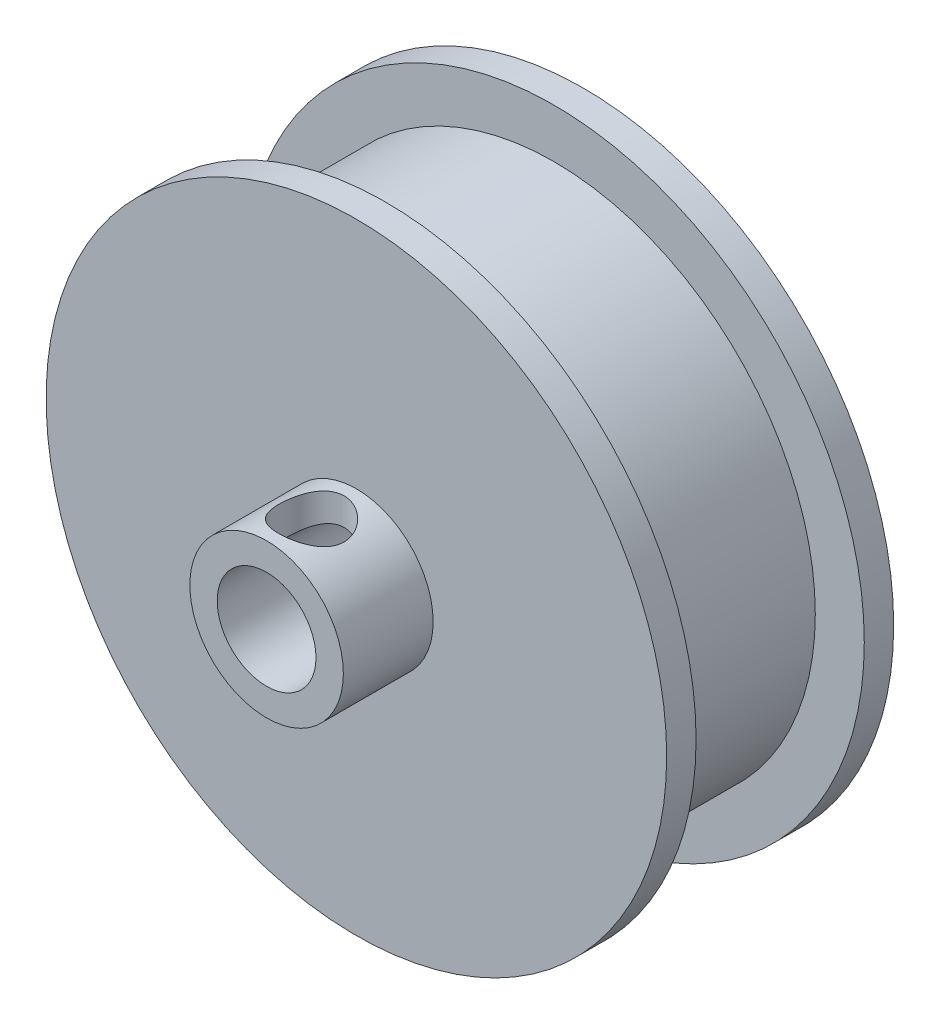
ISO-10303-21;
HEADER;
FILE_DESCRIPTION(('STEP AP214'),'2;1');
FILE_NAME('part.step','',(''),(''),'','','');
FILE_SCHEMA(('AUTOMOTIVE_DESIGN { 1 0 10303 214 1 1 1 1 }'));
ENDSEC;
DATA;
#1=APPLICATION_CONTEXT('core data for automotive mechanical design processes');
#2=APPLICATION_PROTOCOL_DEFINITION('international standard','automotive_design',2000,#1);
#3=PRODUCT_CONTEXT('',#1,'mechanical');
#4=PRODUCT('Part','Part','',(#3));
#5=PRODUCT_RELATED_PRODUCT_CATEGORY('part','',(#4));
#6=PRODUCT_DEFINITION_FORMATION('','',#4);
#7=PRODUCT_DEFINITION_CONTEXT('part definition',#1,'design');
#8=PRODUCT_DEFINITION('design','',#6,#7);
#9=PRODUCT_DEFINITION_SHAPE('','',#8);
#10=(LENGTH_UNIT() NAMED_UNIT(*) SI_UNIT(.MILLI.,.METRE.));
#11=(NAMED_UNIT(*) PLANE_ANGLE_UNIT() SI_UNIT($,.RADIAN.));
#12=(NAMED_UNIT(*) SI_UNIT($,.STERADIAN.) SOLID_ANGLE_UNIT());
#13=UNCERTAINTY_MEASURE_WITH_UNIT(LENGTH_MEASURE(1.E-05),#10,'distance_accuracy_value','');
#14=(GEOMETRIC_REPRESENTATION_CONTEXT(3) GLOBAL_UNCERTAINTY_ASSIGNED_CONTEXT((#13)) GLOBAL_UNIT_ASSIGNED_CONTEXT((#10,
#11,#12)) REPRESENTATION_CONTEXT('',''));
#15=CARTESIAN_POINT('',(0.,0.,0.));
#16=DIRECTION('',(0.,0.,1.));
#17=DIRECTION('',(1.,0.,0.));
#18=AXIS2_PLACEMENT_3D('',#15,#16,#17);
#19=CARTESIAN_POINT('',(0.,0.,6.95));
#20=DIRECTION('',(0.,0.,-1.));
#21=DIRECTION('',(-1.,0.,0.));
#22=AXIS2_PLACEMENT_3D('',#19,#20,#21);
#23=CYLINDRICAL_SURFACE('',#22,3.025);
#24=CARTESIAN_POINT('',(0.,0.,12.45));
#25=DIRECTION('',(0.,0.,1.));
#26=DIRECTION('',(1.,0.,0.));
#27=AXIS2_PLACEMENT_3D('',#24,#25,#26);
#28=CIRCLE('',#27,3.025);
#29=CARTESIAN_POINT('',(3.025,0.,12.45));
#30=VERTEX_POINT('',#29);
#31=EDGE_CURVE('E79',#30,#30,#28,.T.);
#32=ORIENTED_EDGE('',*,*,#31,.T.);
#33=EDGE_LOOP('',(#32));
#34=FACE_BOUND('',#33,.T.);
#35=CARTESIAN_POINT('',(0.,0.,-6.95));
#36=DIRECTION('',(0.,0.,1.));
#37=DIRECTION('',(1.,0.,0.));
#38=AXIS2_PLACEMENT_3D('',#35,#36,#37);
#39=CIRCLE('',#38,3.025);
#40=CARTESIAN_POINT('',(3.025,0.,-6.95));
#41=VERTEX_POINT('',#40);
#42=EDGE_CURVE('E53',#41,#41,#39,.T.);
#43=ORIENTED_EDGE('',*,*,#42,.F.);
#44=EDGE_LOOP('',(#43));
#45=FACE_BOUND('',#44,.T.);
#46=CARTESIAN_POINT('',(0.,3.025,7.7));
#47=CARTESIAN_POINT('',(-0.100642617545443,3.0249987783567,7.70000120399706));
#48=CARTESIAN_POINT('',(-0.201297476451969,3.01993299908086,7.70763918314827));
#49=CARTESIAN_POINT('',(-0.399407420799123,3.00017112360042,7.73772383693425));
#50=CARTESIAN_POINT('',(-0.496860581658116,2.98546934240776,7.76017925352083));
#51=CARTESIAN_POINT('',(-0.685406514791431,2.94788928584531,7.81853239841244));
#52=CARTESIAN_POINT('',(-0.77652679162158,2.9250494038349,7.85436704448431));
#53=CARTESIAN_POINT('',(-0.951102248223408,2.87303630646243,7.93796086625516));
#54=CARTESIAN_POINT('',(-1.03455640299659,2.84386224593824,7.98572163337046));
#55=CARTESIAN_POINT('',(-1.1993664317277,2.77860517215513,8.09619850933004));
#56=CARTESIAN_POINT('',(-1.27995339778043,2.74214718793265,8.15983549631194));
#57=CARTESIAN_POINT('',(-1.43004114549588,2.66695898812271,8.29806837761625));
#58=CARTESIAN_POINT('',(-1.49952590979975,2.62822559792703,8.37267981240007));
#59=CARTESIAN_POINT('',(-1.63642694811529,2.54559569213749,8.54416649867465));
#60=CARTESIAN_POINT('',(-1.70185902015384,2.50182778570157,8.64270030985283));
#61=CARTESIAN_POINT('',(-1.81513895163526,2.42089760145931,8.85185343247864));
#62=CARTESIAN_POINT('',(-1.86301722866889,2.38372395524591,8.96245140311269));
#63=CARTESIAN_POINT('',(-1.92790941909835,2.33131127968343,9.16080288815675));
#64=CARTESIAN_POINT('',(-1.94983031145749,2.3128404086022,9.24608882179241));
#65=CARTESIAN_POINT('',(-1.98230173644163,2.28507624082387,9.42019621834675));
#66=CARTESIAN_POINT('',(-1.99287137832762,2.27576752231628,9.50901147754151));
#67=CARTESIAN_POINT('',(-2.00197996643278,2.26776224993919,9.68810230830303));
#68=CARTESIAN_POINT('',(-2.00047243567843,2.26910669275792,9.77838218574456));
#69=CARTESIAN_POINT('',(-1.98542700585713,2.28227832992203,9.95718548618679));
#70=CARTESIAN_POINT('',(-1.97187893783001,2.29411438504498,10.0457073598269));
#71=CARTESIAN_POINT('',(-1.93441748703559,2.32577203848501,10.2150249556095));
#72=CARTESIAN_POINT('',(-1.91095118389035,2.3452468580049,10.2959886169975));
#73=CARTESIAN_POINT('',(-1.85474587741065,2.38994328199187,10.4529093217787));
#74=CARTESIAN_POINT('',(-1.82200382976829,2.41516677264586,10.5288647113465));
#75=CARTESIAN_POINT('',(-1.74062365832932,2.47464586658619,10.689914970672));
#76=CARTESIAN_POINT('',(-1.69011177897742,2.50969726935146,10.7737667143711));
#77=CARTESIAN_POINT('',(-1.57789269135683,2.58173148940282,10.9327776291153));
#78=CARTESIAN_POINT('',(-1.51617174973991,2.61871663588472,11.0079259496748));
#79=CARTESIAN_POINT('',(-1.36825223388174,2.69944551804657,11.1634469856888));
#80=CARTESIAN_POINT('',(-1.27963305562048,2.74299173909087,11.2416455785507));
#81=CARTESIAN_POINT('',(-1.08829088468167,2.82436277312043,11.3821621524632));
#82=CARTESIAN_POINT('',(-0.985581704313003,2.86219311394096,11.4444955172644));
#83=CARTESIAN_POINT('',(-0.789532778941591,2.92157423058359,11.5401294705185));
#84=CARTESIAN_POINT('',(-0.698331651394651,2.9448638502207,11.5767301836017));
#85=CARTESIAN_POINT('',(-0.509974561365831,2.98324682151488,11.6364045017915));
#86=CARTESIAN_POINT('',(-0.412823666926972,2.99834704378092,11.6594894474371));
#87=CARTESIAN_POINT('',(-0.214732767837397,3.01901724877256,11.6909754675224));
#88=CARTESIAN_POINT('',(-0.11377891660282,3.02454808313808,11.6993162265056));
#89=CARTESIAN_POINT('',(0.08827490320082,3.02539816006898,11.7006024658699));
#90=CARTESIAN_POINT('',(0.189374865880597,3.02071780334157,11.6935485503683));
#91=CARTESIAN_POINT('',(0.381767939018031,3.00226630998737,11.6654713815535));
#92=CARTESIAN_POINT('',(0.473265865733121,2.9891210741874,11.6454093059232));
#93=CARTESIAN_POINT('',(0.651304981345674,2.95544286376606,11.5932545777779));
#94=CARTESIAN_POINT('',(0.737845372463179,2.93490870394887,11.5611599951939));
#95=CARTESIAN_POINT('',(0.909671296368378,2.88645021717455,11.4837986244011));
#96=CARTESIAN_POINT('',(0.994525548315689,2.85813838308447,11.4378228543548));
#97=CARTESIAN_POINT('',(1.15562685582589,2.79688987995517,11.3351349952313));
#98=CARTESIAN_POINT('',(1.23186824324879,2.76395019694144,11.2784159009105));
#99=CARTESIAN_POINT('',(1.38625078703641,2.69023227350938,11.1457657904491));
#100=CARTESIAN_POINT('',(1.46280246171431,2.64903627604967,11.0682160416802));
#101=CARTESIAN_POINT('',(1.60248518218092,2.56694988781008,10.9016111254721));
#102=CARTESIAN_POINT('',(1.66560818311131,2.52605969430337,10.8125491123265));
#103=CARTESIAN_POINT('',(1.77180282800471,2.45256947866062,10.6330116479057));
#104=CARTESIAN_POINT('',(1.81622554222599,2.41955004513944,10.5435113156178));
#105=CARTESIAN_POINT('',(1.89174612763738,2.36097775731043,10.3568040613348));
#106=CARTESIAN_POINT('',(1.92286805386102,2.33541145056868,10.2596114318735));
#107=CARTESIAN_POINT('',(1.96611703059194,2.29905930446256,10.0763918780719));
#108=CARTESIAN_POINT('',(1.98057383955256,2.2864996133779,9.99127578933898));
#109=CARTESIAN_POINT('',(1.99832459579881,2.27100707562216,9.81905002442775));
#110=CARTESIAN_POINT('',(2.00162949221253,2.26806478651924,9.73194238825282));
#111=CARTESIAN_POINT('',(1.99686400840466,2.27226006140056,9.55828636602112));
#112=CARTESIAN_POINT('',(1.98879215912862,2.27939892714264,9.47173805363841));
#113=CARTESIAN_POINT('',(1.96180765860033,2.30265967673578,9.30155537000174));
#114=CARTESIAN_POINT('',(1.94288066764141,2.31879344211434,9.21792500870731));
#115=CARTESIAN_POINT('',(1.88853640463144,2.36338668506866,9.03281773634975));
#116=CARTESIAN_POINT('',(1.85000940230073,2.39401916394776,8.93278671871945));
#117=CARTESIAN_POINT('',(1.75875296775858,2.4618364901973,8.74186280751888));
#118=CARTESIAN_POINT('',(1.70600376756291,2.49903043253554,8.65098287671915));
#119=CARTESIAN_POINT('',(1.58660143921209,2.57652397210842,8.47772806406638));
#120=CARTESIAN_POINT('',(1.51972274368281,2.61686628824137,8.39552830736307));
#121=CARTESIAN_POINT('',(1.37352970310745,2.69647449530486,8.2423909046251));
#122=CARTESIAN_POINT('',(1.29421174234046,2.73574006934783,8.17145654520685));
#123=CARTESIAN_POINT('',(1.11295786075001,2.81477128758288,8.03390374857185));
#124=CARTESIAN_POINT('',(1.00942412682184,2.85394790411945,7.96902276178672));
#125=CARTESIAN_POINT('',(0.789646169800204,2.9223698098855,7.85839465354481));
#126=CARTESIAN_POINT('',(0.673425510575372,2.95163311005191,7.81261279654635));
#127=CARTESIAN_POINT('',(0.463954469027434,2.99057955194841,7.75235804291387));
#128=CARTESIAN_POINT('',(0.372726683285134,3.00339087807589,7.73281288538721));
#129=CARTESIAN_POINT('',(0.187668467681293,3.02059926936491,7.70663698970701));
#130=CARTESIAN_POINT('',(0.0938395550181366,3.02500113906481,7.69999887738861));
#131=CARTESIAN_POINT('',(0.,3.025,7.7));
#132=B_SPLINE_CURVE_WITH_KNOTS('',3,(#46,#47,#48,#49,#50,#51,#52,#53,#54,#55,#56,#57,#58,#59,
#60,#61,#62,#63,#64,#65,#66,#67,#68,#69,#70,#71,#72,#73,#74,#75,#76,#77,#78,#79,#80,#81,#82,#83,
#84,#85,#86,#87,#88,#89,#90,#91,#92,#93,#94,#95,#96,#97,#98,#99,#100,#101,#102,#103,#104,#105,
#106,#107,#108,#109,#110,#111,#112,#113,#114,#115,#116,#117,#118,#119,#120,#121,#122,#123,#124,
#125,#126,#127,#128,#129,#130,#131),.UNSPECIFIED.,.T.,.F.,(4,2,2,2,2,2,2,2,2,2,2,2,2,2,2,2,2,2,
2,2,2,2,2,2,2,2,2,2,2,2,2,2,2,2,2,2,2,2,2,2,2,2,4),(0.,0.3015487261854,0.603275518532284,
0.90359729337094,1.20395916445007,1.5296221539219,1.85575082198353,2.23234945588228,
2.60829239236122,2.87713902044292,3.14553234581872,3.41495903262255,3.68461348298609,
3.94322790551536,4.20192730406332,4.51276392728465,4.8239839889588,5.20005220793538,
5.57575437031097,5.87746307605224,6.17891826595882,6.4816038183107,6.78427749289961,
7.06680260771108,7.3493730602407,7.64994767467169,7.95071895936767,8.29882678891969,
8.64714257948896,8.96167116055969,9.27562847127143,9.53621105204697,9.79653771407238,
10.0568979945935,10.3176030073973,10.6502710247593,10.983403835499,11.3223223758499,
11.6613396128591,12.0440942372523,12.4261496795824,12.7074756225657,12.9886407886918),.UNSPECIFIED.);
#133=CARTESIAN_POINT('',(0.,3.025,7.7));
#134=VERTEX_POINT('',#133);
#135=EDGE_CURVE('E77',#134,#134,#132,.T.);
#136=ORIENTED_EDGE('',*,*,#135,.T.);
#137=EDGE_LOOP('',(#136));
#138=FACE_BOUND('',#137,.T.);
#139=ADVANCED_FACE('F35',(#34,#45,#138),#23,.F.);
#140=CARTESIAN_POINT('',(0.,0.,12.45));
#141=DIRECTION('',(0.,0.,-1.));
#142=DIRECTION('',(-1.,0.,0.));
#143=AXIS2_PLACEMENT_3D('',#140,#141,#142);
#144=CYLINDRICAL_SURFACE('',#143,4.7);
#145=CARTESIAN_POINT('',(0.,0.,12.45));
#146=DIRECTION('',(0.,0.,1.));
#147=DIRECTION('',(1.,0.,0.));
#148=AXIS2_PLACEMENT_3D('',#145,#146,#147);
#149=CIRCLE('',#148,4.7);
#150=CARTESIAN_POINT('',(4.7,0.,12.45));
#151=VERTEX_POINT('',#150);
#152=EDGE_CURVE('E143',#151,#151,#149,.T.);
#153=ORIENTED_EDGE('',*,*,#152,.F.);
#154=EDGE_LOOP('',(#153));
#155=FACE_BOUND('',#154,.T.);
#156=CARTESIAN_POINT('',(0.,0.,6.95));
#157=DIRECTION('',(0.,0.,1.));
#158=DIRECTION('',(1.,0.,0.));
#159=AXIS2_PLACEMENT_3D('',#156,#157,#158);
#160=CIRCLE('',#159,4.7);
#161=CARTESIAN_POINT('',(4.7,0.,6.95));
#162=VERTEX_POINT('',#161);
#163=EDGE_CURVE('E82',#162,#162,#160,.T.);
#164=ORIENTED_EDGE('',*,*,#163,.T.);
#165=EDGE_LOOP('',(#164));
#166=FACE_BOUND('',#165,.T.);
#167=CARTESIAN_POINT('',(0.,4.7,7.7));
#168=CARTESIAN_POINT('',(-0.10692485662613,4.69999666346683,7.70000417760869));
#169=CARTESIAN_POINT('',(-0.214029147523676,4.69630997958722,7.70862509214498));
#170=CARTESIAN_POINT('',(-0.425181969338198,4.68193129468864,7.74277903621876));
#171=CARTESIAN_POINT('',(-0.529222010676268,4.67122145225011,7.76835514001884));
#172=CARTESIAN_POINT('',(-0.730857018166164,4.6439382867363,7.83530438478649));
#173=CARTESIAN_POINT('',(-0.828472851638892,4.62738518558675,7.87662308355906));
#174=CARTESIAN_POINT('',(-1.01528873528886,4.59001917808983,7.97365253204055));
#175=CARTESIAN_POINT('',(-1.10449112492873,4.56920746103547,8.02935926477567));
#176=CARTESIAN_POINT('',(-1.27672442730341,4.52418738012171,8.15663434582691));
#177=CARTESIAN_POINT('',(-1.35926174130374,4.49986471050801,8.2288298481395));
#178=CARTESIAN_POINT('',(-1.51148486557321,4.45104663598243,8.38570539203694));
#179=CARTESIAN_POINT('',(-1.58116363688477,4.42655114403707,8.47039222619485));
#180=CARTESIAN_POINT('',(-1.70926620438313,4.37873614072174,8.65516211964604));
#181=CARTESIAN_POINT('',(-1.76691948260528,4.35554338207605,8.75581566372163));
#182=CARTESIAN_POINT('',(-1.86425663183146,4.31478302503359,8.96651927893424));
#183=CARTESIAN_POINT('',(-1.90395015104001,4.29721240784208,9.07656426701224));
#184=CARTESIAN_POINT('',(-1.96218047468407,4.27092831245099,9.29724464154552));
#185=CARTESIAN_POINT('',(-1.98166946145791,4.26181855593757,9.40757970733334));
#186=CARTESIAN_POINT('',(-2.00190551580218,4.25235376934774,9.630300948235));
#187=CARTESIAN_POINT('',(-2.00266356932707,4.25199360751372,9.74268588235903));
#188=CARTESIAN_POINT('',(-1.98613114332845,4.25973480930859,9.95663895816199));
#189=CARTESIAN_POINT('',(-1.97029063184602,4.26715642894014,10.0583487666607));
#190=CARTESIAN_POINT('',(-1.92345076957673,4.28847200647672,10.2574994197707));
#191=CARTESIAN_POINT('',(-1.89244836602801,4.30236726778646,10.3549394003694));
#192=CARTESIAN_POINT('',(-1.81555525499754,4.33538182828041,10.5452986664836));
#193=CARTESIAN_POINT('',(-1.76935615153357,4.35460791814086,10.6380740220482));
#194=CARTESIAN_POINT('',(-1.6636001351201,4.39609554669109,10.8149264994477));
#195=CARTESIAN_POINT('',(-1.60403783137094,4.41835830896888,10.8990000908782));
#196=CARTESIAN_POINT('',(-1.46706161105033,4.46580649160273,11.0638947819234));
#197=CARTESIAN_POINT('',(-1.38853428286767,4.49107619261281,11.143769424756));
#198=CARTESIAN_POINT('',(-1.21895987758281,4.54003526731224,11.2895413414367));
#199=CARTESIAN_POINT('',(-1.12790962219509,4.56372423754232,11.3554350561332));
#200=CARTESIAN_POINT('',(-0.932892208107861,4.60759525061253,11.4728448716456));
#201=CARTESIAN_POINT('',(-0.828658921880045,4.62767475219198,11.5239601132258));
#202=CARTESIAN_POINT('',(-0.611999597864047,4.66127045529352,11.6075949314454));
#203=CARTESIAN_POINT('',(-0.499578330107226,4.67479044353611,11.6401252388527));
#204=CARTESIAN_POINT('',(-0.277630042436054,4.69302696251971,11.683649108146));
#205=CARTESIAN_POINT('',(-0.168394456422568,4.69826133714206,11.6959118514077));
#206=CARTESIAN_POINT('',(0.0506909318671914,4.70100171313263,11.7023560092764));
#207=CARTESIAN_POINT('',(0.160540537963261,4.69851005621543,11.6965429025652));
#208=CARTESIAN_POINT('',(0.371686977978058,4.68641210333225,11.6678946833195));
#209=CARTESIAN_POINT('',(0.47313081948953,4.67718429534675,11.6459647109599));
#210=CARTESIAN_POINT('',(0.670779642565015,4.65295337017062,11.5869804824908));
#211=CARTESIAN_POINT('',(0.766983967852256,4.63794953139232,11.5499243366647));
#212=CARTESIAN_POINT('',(0.95481713723941,4.60301416311766,11.4605342764179));
#213=CARTESIAN_POINT('',(1.04620957436518,4.58294349394268,11.4077597640921));
#214=CARTESIAN_POINT('',(1.21917036985224,4.53999757346506,11.2889133644913));
#215=CARTESIAN_POINT('',(1.30073453226727,4.5171211326565,11.2228358297364));
#216=CARTESIAN_POINT('',(1.45810635459966,4.46891425913783,11.0735165514297));
#217=CARTESIAN_POINT('',(1.53303460911794,4.44352785937345,10.9893637034481));
#218=CARTESIAN_POINT('',(1.66796692006086,4.3946613909747,10.8093003437844));
#219=CARTESIAN_POINT('',(1.72796702854655,4.3711818277311,10.7133867318083));
#220=CARTESIAN_POINT('',(1.83214915735023,4.32856380704773,10.5102294872308));
#221=CARTESIAN_POINT('',(1.87604556209347,4.30950575213662,10.4028212490079));
#222=CARTESIAN_POINT('',(1.94474056712953,4.27895122845934,10.1810678501511));
#223=CARTESIAN_POINT('',(1.96955583238523,4.26744816264914,10.066728837061));
#224=CARTESIAN_POINT('',(1.99769489254577,4.25434295041792,9.84415969662034));
#225=CARTESIAN_POINT('',(2.00257140660816,4.25202592957534,9.73616724271675));
#226=CARTESIAN_POINT('',(1.99487613358543,4.25564197431861,9.52095810814777));
#227=CARTESIAN_POINT('',(1.9823073158831,4.26157363589046,9.41374129858159));
#228=CARTESIAN_POINT('',(1.94140075202275,4.28035344687555,9.20873501518394));
#229=CARTESIAN_POINT('',(1.91389354633939,4.29283623543807,9.11074306961365));
#230=CARTESIAN_POINT('',(1.84472274227802,4.3230098398554,8.92075278397802));
#231=CARTESIAN_POINT('',(1.8030551310714,4.34070213180871,8.8287561517038));
#232=CARTESIAN_POINT('',(1.70380013805169,4.38064955133802,8.64718446992673));
#233=CARTESIAN_POINT('',(1.64539111331458,4.40311841518084,8.55810652394598));
#234=CARTESIAN_POINT('',(1.51543520489265,4.44951830972454,8.3905312033708));
#235=CARTESIAN_POINT('',(1.4438834576808,4.47344987951198,8.31203776433212));
#236=CARTESIAN_POINT('',(1.28311316784953,4.52230061095796,8.16160685512554));
#237=CARTESIAN_POINT('',(1.19295633781391,4.54715303874267,8.09064571060983));
#238=CARTESIAN_POINT('',(1.00110572168194,4.59320207857633,7.964792782678));
#239=CARTESIAN_POINT('',(0.899406731265102,4.61439703053886,7.90990828842813));
#240=CARTESIAN_POINT('',(0.688754778736438,4.65046916581282,7.81888674411701));
#241=CARTESIAN_POINT('',(0.579934660978088,4.66543698129172,7.78247892162885));
#242=CARTESIAN_POINT('',(0.357118139670209,4.68774068780566,7.72882818466174));
#243=CARTESIAN_POINT('',(0.243138975852847,4.69510028390528,7.71152573169568));
#244=CARTESIAN_POINT('',(0.107217974604443,4.69882649197179,7.70275978030988));
#245=CARTESIAN_POINT('',(0.085791716426806,4.69926588054057,7.70172572561387));
#246=CARTESIAN_POINT('',(0.0429127148599509,4.69985297014782,7.70034541441807));
#247=CARTESIAN_POINT('',(0.0214599713315615,4.70000066964697,7.69999916154797));
#248=CARTESIAN_POINT('',(0.,4.7,7.7));
#249=B_SPLINE_CURVE_WITH_KNOTS('',3,(#167,#168,#169,#170,#171,#172,#173,#174,#175,#176,#177,
#178,#179,#180,#181,#182,#183,#184,#185,#186,#187,#188,#189,#190,#191,#192,#193,#194,#195,#196,
#197,#198,#199,#200,#201,#202,#203,#204,#205,#206,#207,#208,#209,#210,#211,#212,#213,#214,#215,
#216,#217,#218,#219,#220,#221,#222,#223,#224,#225,#226,#227,#228,#229,#230,#231,#232,#233,#234,
#235,#236,#237,#238,#239,#240,#241,#242,#243,#244,#245,#246,#247,#248),.UNSPECIFIED.,.T.,.F.,(4,
2,2,2,2,2,2,2,2,2,2,2,2,2,2,2,2,2,2,2,2,2,2,2,2,2,2,2,2,2,2,2,2,2,2,2,2,2,2,2,4),(0.,
0.320685870740781,0.642189574611706,0.962591377108327,1.28290382361418,1.61841340515282,
1.95410610831837,2.30719760284092,2.66009918637441,2.99548738847847,3.33067887603654,
3.63885054781472,3.94708429379074,4.26200485734005,4.57705269099896,4.91998444470497,
5.26300339473444,5.6146023857879,5.96599816115577,6.29441640325176,6.62273511344724,
6.9339015878588,7.24510694828039,7.56602199898565,7.88707357487126,8.23200483136418,
8.57702721260244,8.92790276334687,9.27847151948977,9.6011503586167,9.92377428107512,
10.2300648758706,10.5364423409171,10.8616669689513,11.1870121912647,11.5375157922178,
11.8881780666705,12.23354123211,12.5778250702761,12.6421868425757,12.7065489545268),.UNSPECIFIED.);
#250=CARTESIAN_POINT('',(0.,4.7,7.7));
#251=VERTEX_POINT('',#250);
#252=EDGE_CURVE('E39',#251,#251,#249,.T.);
#253=ORIENTED_EDGE('',*,*,#252,.F.);
#254=EDGE_LOOP('',(#253));
#255=FACE_BOUND('',#254,.T.);
#256=ADVANCED_FACE('F72',(#155,#166,#255),#144,.T.);
#257=CARTESIAN_POINT('',(0.,0.,6.95));
#258=DIRECTION('',(0.,0.,1.));
#259=DIRECTION('',(1.,0.,0.));
#260=AXIS2_PLACEMENT_3D('',#257,#258,#259);
#261=PLANE('',#260);
#262=CARTESIAN_POINT('',(0.,0.,6.95));
#263=DIRECTION('',(0.,0.,1.));
#264=DIRECTION('',(1.,0.,0.));
#265=AXIS2_PLACEMENT_3D('',#262,#263,#264);
#266=CIRCLE('',#265,19.);
#267=CARTESIAN_POINT('',(19.,0.,6.95));
#268=VERTEX_POINT('',#267);
#269=EDGE_CURVE('E10',#268,#268,#266,.T.);
#270=ORIENTED_EDGE('',*,*,#269,.T.);
#271=EDGE_LOOP('',(#270));
#272=FACE_BOUND('',#271,.T.);
#273=ORIENTED_EDGE('',*,*,#163,.F.);
#274=EDGE_LOOP('',(#273));
#275=FACE_BOUND('',#274,.T.);
#276=ADVANCED_FACE('F104',(#272,#275),#261,.T.);
#277=CARTESIAN_POINT('',(0.,0.,6.95));
#278=DIRECTION('',(0.,0.,-1.));
#279=DIRECTION('',(-1.,0.,0.));
#280=AXIS2_PLACEMENT_3D('',#277,#278,#279);
#281=CYLINDRICAL_SURFACE('',#280,19.);
#282=CARTESIAN_POINT('',(0.,0.,-6.95));
#283=DIRECTION('',(0.,0.,1.));
#284=DIRECTION('',(1.,0.,0.));
#285=AXIS2_PLACEMENT_3D('',#282,#283,#284);
#286=CIRCLE('',#285,19.);
#287=CARTESIAN_POINT('',(19.,0.,-6.95));
#288=VERTEX_POINT('',#287);
#289=EDGE_CURVE('E48',#288,#288,#286,.T.);
#290=ORIENTED_EDGE('',*,*,#289,.T.);
#291=EDGE_LOOP('',(#290));
#292=FACE_BOUND('',#291,.T.);
#293=CARTESIAN_POINT('',(0.,0.,-5.15));
#294=DIRECTION('',(0.,0.,1.));
#295=DIRECTION('',(1.,0.,0.));
#296=AXIS2_PLACEMENT_3D('',#293,#294,#295);
#297=CIRCLE('',#296,19.);
#298=CARTESIAN_POINT('',(19.,0.,-5.15));
#299=VERTEX_POINT('',#298);
#300=EDGE_CURVE('E60',#299,#299,#297,.T.);
#301=ORIENTED_EDGE('',*,*,#300,.F.);
#302=EDGE_LOOP('',(#301));
#303=FACE_BOUND('',#302,.T.);
#304=ADVANCED_FACE('F125',(#292,#303),#281,.T.);
#305=CARTESIAN_POINT('',(0.,0.,-6.95));
#306=DIRECTION('',(0.,0.,1.));
#307=DIRECTION('',(1.,0.,0.));
#308=AXIS2_PLACEMENT_3D('',#305,#306,#307);
#309=PLANE('',#308);
#310=ORIENTED_EDGE('',*,*,#289,.F.);
#311=EDGE_LOOP('',(#310));
#312=FACE_BOUND('',#311,.T.);
#313=ORIENTED_EDGE('',*,*,#42,.T.);
#314=EDGE_LOOP('',(#313));
#315=FACE_BOUND('',#314,.T.);
#316=ADVANCED_FACE('F68',(#312,#315),#309,.F.);
#317=CARTESIAN_POINT('',(0.,0.,5.15));
#318=DIRECTION('',(0.,0.,1.));
#319=DIRECTION('',(1.,0.,0.));
#320=AXIS2_PLACEMENT_3D('',#317,#318,#319);
#321=CIRCLE('',#320,19.);
#322=CARTESIAN_POINT('',(19.,0.,5.15));
#323=VERTEX_POINT('',#322);
#324=EDGE_CURVE('E58',#323,#323,#321,.T.);
#325=ORIENTED_EDGE('',*,*,#324,.T.);
#326=EDGE_LOOP('',(#325));
#327=FACE_BOUND('',#326,.T.);
#328=ORIENTED_EDGE('',*,*,#269,.F.);
#329=EDGE_LOOP('',(#328));
#330=FACE_BOUND('',#329,.T.);
#331=ADVANCED_FACE('F37',(#327,#330),#281,.T.);
#332=CARTESIAN_POINT('',(0.,0.,-5.15));
#333=DIRECTION('',(0.,0.,1.));
#334=DIRECTION('',(1.,0.,0.));
#335=AXIS2_PLACEMENT_3D('',#332,#333,#334);
#336=PLANE('',#335);
#337=CARTESIAN_POINT('',(0.,0.,-5.15));
#338=DIRECTION('',(0.,0.,1.));
#339=DIRECTION('',(1.,0.,0.));
#340=AXIS2_PLACEMENT_3D('',#337,#338,#339);
#341=CIRCLE('',#340,16.);
#342=CARTESIAN_POINT('',(16.,0.,-5.15));
#343=VERTEX_POINT('',#342);
#344=EDGE_CURVE('E61',#343,#343,#341,.T.);
#345=ORIENTED_EDGE('',*,*,#344,.F.);
#346=EDGE_LOOP('',(#345));
#347=FACE_BOUND('',#346,.T.);
#348=ORIENTED_EDGE('',*,*,#300,.T.);
#349=EDGE_LOOP('',(#348));
#350=FACE_BOUND('',#349,.T.);
#351=ADVANCED_FACE('F110',(#347,#350),#336,.T.);
#352=CARTESIAN_POINT('',(0.,0.,5.15));
#353=DIRECTION('',(0.,0.,1.));
#354=DIRECTION('',(1.,0.,0.));
#355=AXIS2_PLACEMENT_3D('',#352,#353,#354);
#356=PLANE('',#355);
#357=CARTESIAN_POINT('',(0.,0.,5.15));
#358=DIRECTION('',(0.,0.,1.));
#359=DIRECTION('',(1.,0.,0.));
#360=AXIS2_PLACEMENT_3D('',#357,#358,#359);
#361=CIRCLE('',#360,16.);
#362=CARTESIAN_POINT('',(16.,0.,5.15));
#363=VERTEX_POINT('',#362);
#364=EDGE_CURVE('E120',#363,#363,#361,.T.);
#365=ORIENTED_EDGE('',*,*,#364,.T.);
#366=EDGE_LOOP('',(#365));
#367=FACE_BOUND('',#366,.T.);
#368=ORIENTED_EDGE('',*,*,#324,.F.);
#369=EDGE_LOOP('',(#368));
#370=FACE_BOUND('',#369,.T.);
#371=ADVANCED_FACE('F108',(#367,#370),#356,.F.);
#372=CARTESIAN_POINT('',(0.,0.,-5.15));
#373=DIRECTION('',(0.,0.,1.));
#374=DIRECTION('',(1.,0.,0.));
#375=AXIS2_PLACEMENT_3D('',#372,#373,#374);
#376=CYLINDRICAL_SURFACE('',#375,16.);
#377=CARTESIAN_POINT('',(16.,0.,-5.15));
#378=CARTESIAN_POINT('',(16.,0.,-5.04270833333333));
#379=CARTESIAN_POINT('',(16.,0.,-4.93541666666667));
#380=CARTESIAN_POINT('',(16.,0.,-4.72083333333333));
#381=CARTESIAN_POINT('',(16.,0.,-4.61354166666667));
#382=CARTESIAN_POINT('',(16.,0.,-4.39895833333333));
#383=CARTESIAN_POINT('',(16.,0.,-4.29166666666667));
#384=CARTESIAN_POINT('',(16.,0.,-4.07708333333333));
#385=CARTESIAN_POINT('',(16.,0.,-3.96979166666667));
#386=CARTESIAN_POINT('',(16.,0.,-3.75520833333333));
#387=CARTESIAN_POINT('',(16.,0.,-3.64791666666667));
#388=CARTESIAN_POINT('',(16.,0.,-3.43333333333333));
#389=CARTESIAN_POINT('',(16.,0.,-3.32604166666667));
#390=CARTESIAN_POINT('',(16.,0.,-3.11145833333333));
#391=CARTESIAN_POINT('',(16.,0.,-3.00416666666667));
#392=CARTESIAN_POINT('',(16.,0.,-2.78958333333333));
#393=CARTESIAN_POINT('',(16.,0.,-2.68229166666667));
#394=CARTESIAN_POINT('',(16.,0.,-2.46770833333333));
#395=CARTESIAN_POINT('',(16.,0.,-2.36041666666667));
#396=CARTESIAN_POINT('',(16.,0.,-2.14583333333333));
#397=CARTESIAN_POINT('',(16.,0.,-2.03854166666667));
#398=CARTESIAN_POINT('',(16.,0.,-1.82395833333333));
#399=CARTESIAN_POINT('',(16.,0.,-1.71666666666667));
#400=CARTESIAN_POINT('',(16.,0.,-1.50208333333333));
#401=CARTESIAN_POINT('',(16.,0.,-1.39479166666667));
#402=CARTESIAN_POINT('',(16.,0.,-1.18020833333333));
#403=CARTESIAN_POINT('',(16.,0.,-1.07291666666667));
#404=CARTESIAN_POINT('',(16.,0.,-0.858333333333335));
#405=CARTESIAN_POINT('',(16.,0.,-0.751041666666669));
#406=CARTESIAN_POINT('',(16.,0.,-0.536458333333335));
#407=CARTESIAN_POINT('',(16.,0.,-0.429166666666669));
#408=CARTESIAN_POINT('',(16.,0.,-0.214583333333335));
#409=CARTESIAN_POINT('',(16.,0.,-0.107291666666668));
#410=CARTESIAN_POINT('',(16.,0.,0.107291666666665));
#411=CARTESIAN_POINT('',(16.,0.,0.214583333333332));
#412=CARTESIAN_POINT('',(16.,0.,0.429166666666665));
#413=CARTESIAN_POINT('',(16.,0.,0.536458333333332));
#414=CARTESIAN_POINT('',(16.,0.,0.751041666666665));
#415=CARTESIAN_POINT('',(16.,0.,0.858333333333332));
#416=CARTESIAN_POINT('',(16.,0.,1.07291666666667));
#417=CARTESIAN_POINT('',(16.,0.,1.18020833333333));
#418=CARTESIAN_POINT('',(16.,0.,1.39479166666667));
#419=CARTESIAN_POINT('',(16.,0.,1.50208333333333));
#420=CARTESIAN_POINT('',(16.,0.,1.71666666666666));
#421=CARTESIAN_POINT('',(16.,0.,1.82395833333333));
#422=CARTESIAN_POINT('',(16.,0.,2.03854166666666));
#423=CARTESIAN_POINT('',(16.,0.,2.14583333333333));
#424=CARTESIAN_POINT('',(16.,0.,2.36041666666666));
#425=CARTESIAN_POINT('',(16.,0.,2.46770833333333));
#426=CARTESIAN_POINT('',(16.,0.,2.68229166666666));
#427=CARTESIAN_POINT('',(16.,0.,2.78958333333333));
#428=CARTESIAN_POINT('',(16.,0.,3.00416666666667));
#429=CARTESIAN_POINT('',(16.,0.,3.11145833333333));
#430=CARTESIAN_POINT('',(16.,0.,3.32604166666666));
#431=CARTESIAN_POINT('',(16.,0.,3.43333333333333));
#432=CARTESIAN_POINT('',(16.,0.,3.64791666666667));
#433=CARTESIAN_POINT('',(16.,0.,3.75520833333333));
#434=CARTESIAN_POINT('',(16.,0.,3.96979166666666));
#435=CARTESIAN_POINT('',(16.,0.,4.07708333333333));
#436=CARTESIAN_POINT('',(16.,0.,4.29166666666667));
#437=CARTESIAN_POINT('',(16.,0.,4.39895833333333));
#438=CARTESIAN_POINT('',(16.,0.,4.61354166666666));
#439=CARTESIAN_POINT('',(16.,0.,4.72083333333333));
#440=CARTESIAN_POINT('',(16.,0.,4.93541666666667));
#441=CARTESIAN_POINT('',(16.,0.,5.04270833333333));
#442=CARTESIAN_POINT('',(16.,0.,5.15));
#443=B_SPLINE_CURVE_WITH_KNOTS('',3,(#377,#378,#379,#380,#381,#382,#383,#384,#385,#386,#387,
#388,#389,#390,#391,#392,#393,#394,#395,#396,#397,#398,#399,#400,#401,#402,#403,#404,#405,#406,
#407,#408,#409,#410,#411,#412,#413,#414,#415,#416,#417,#418,#419,#420,#421,#422,#423,#424,#425,
#426,#427,#428,#429,#430,#431,#432,#433,#434,#435,#436,#437,#438,#439,#440,#441,#442),
.UNSPECIFIED.,.F.,.F.,(4,2,2,2,2,2,2,2,2,2,2,2,2,2,2,2,2,2,2,2,2,2,2,2,2,2,2,2,2,2,2,2,4),(0.,
0.321875,0.64375,0.965625,1.2875,1.609375,1.93125,2.253125,2.575,2.896875,3.21875,3.540625,
3.8625,4.184375,4.50625,4.828125,5.15,5.471875,5.79375,6.115625,6.4375,6.759375,7.08125,
7.403125,7.725,8.046875,8.36875,8.690625,9.0125,9.334375,9.65625,9.978125,10.3),.UNSPECIFIED.);
#444=EDGE_CURVE('BSEAM99',#343,#363,#443,.T.);
#445=ORIENTED_EDGE('',*,*,#344,.T.);
#446=ORIENTED_EDGE('',*,*,#364,.F.);
#447=ORIENTED_EDGE('',*,*,#444,.T.);
#448=ORIENTED_EDGE('',*,*,#444,.F.);
#449=EDGE_LOOP('',(#445,#447,#446,#448));
#450=FACE_BOUND('',#449,.T.);
#451=ADVANCED_FACE('F99',(#450),#376,.T.);
#452=CARTESIAN_POINT('',(0.,0.,12.45));
#453=DIRECTION('',(0.,0.,1.));
#454=DIRECTION('',(1.,0.,0.));
#455=AXIS2_PLACEMENT_3D('',#452,#453,#454);
#456=PLANE('',#455);
#457=ORIENTED_EDGE('',*,*,#152,.T.);
#458=EDGE_LOOP('',(#457));
#459=FACE_BOUND('',#458,.T.);
#460=ORIENTED_EDGE('',*,*,#31,.F.);
#461=EDGE_LOOP('',(#460));
#462=FACE_BOUND('',#461,.T.);
#463=ADVANCED_FACE('F96',(#459,#462),#456,.T.);
#464=CARTESIAN_POINT('',(0.,19.,9.7));
#465=DIRECTION('',(0.,-1.,0.));
#466=DIRECTION('',(0.,0.,-1.));
#467=AXIS2_PLACEMENT_3D('',#464,#465,#466);
#468=CYLINDRICAL_SURFACE('',#467,2.);
#469=ORIENTED_EDGE('',*,*,#135,.F.);
#470=EDGE_LOOP('',(#469));
#471=FACE_BOUND('',#470,.T.);
#472=ORIENTED_EDGE('',*,*,#252,.T.);
#473=EDGE_LOOP('',(#472));
#474=FACE_BOUND('',#473,.T.);
#475=ADVANCED_FACE('F92',(#471,#474),#468,.F.);
#476=CLOSED_SHELL('',(#139,#256,#276,#304,#316,#331,#351,#371,#451,#463,#475));
#477=MANIFOLD_SOLID_BREP('B2',#476);
#478=ADVANCED_BREP_SHAPE_REPRESENTATION('',(#18,#477),#14);
#479=SHAPE_DEFINITION_REPRESENTATION(#9,#478);
ENDSEC;
END-ISO-10303-21;
